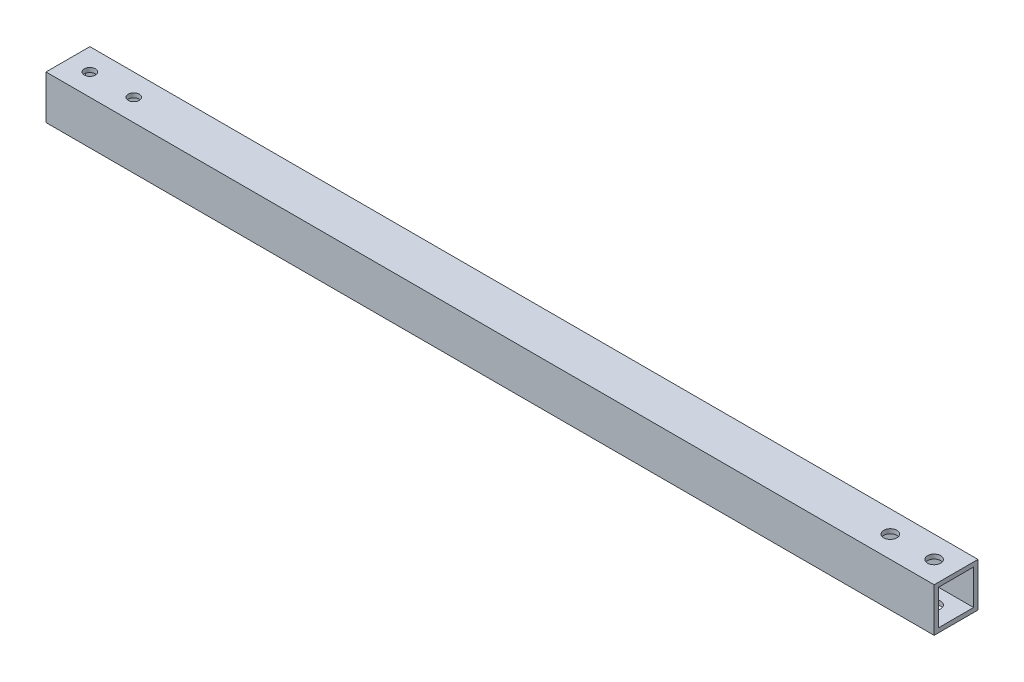
ISO-10303-21;
HEADER;
FILE_DESCRIPTION(('STEP AP214'),'2;1');
FILE_NAME('part.step','',(''),(''),'','','');
FILE_SCHEMA(('AUTOMOTIVE_DESIGN { 1 0 10303 214 1 1 1 1 }'));
ENDSEC;
DATA;
#1=APPLICATION_CONTEXT('core data for automotive mechanical design processes');
#2=APPLICATION_PROTOCOL_DEFINITION('international standard','automotive_design',2000,#1);
#3=PRODUCT_CONTEXT('',#1,'mechanical');
#4=PRODUCT('Part','Part','',(#3));
#5=PRODUCT_RELATED_PRODUCT_CATEGORY('part','',(#4));
#6=PRODUCT_DEFINITION_FORMATION('','',#4);
#7=PRODUCT_DEFINITION_CONTEXT('part definition',#1,'design');
#8=PRODUCT_DEFINITION('design','',#6,#7);
#9=PRODUCT_DEFINITION_SHAPE('','',#8);
#10=(LENGTH_UNIT() NAMED_UNIT(*) SI_UNIT(.MILLI.,.METRE.));
#11=(NAMED_UNIT(*) PLANE_ANGLE_UNIT() SI_UNIT($,.RADIAN.));
#12=(NAMED_UNIT(*) SI_UNIT($,.STERADIAN.) SOLID_ANGLE_UNIT());
#13=UNCERTAINTY_MEASURE_WITH_UNIT(LENGTH_MEASURE(1.E-05),#10,'distance_accuracy_value','');
#14=(GEOMETRIC_REPRESENTATION_CONTEXT(3) GLOBAL_UNCERTAINTY_ASSIGNED_CONTEXT((#13)) GLOBAL_UNIT_ASSIGNED_CONTEXT((#10,
#11,#12)) REPRESENTATION_CONTEXT('',''));
#15=CARTESIAN_POINT('',(0.,0.,0.));
#16=DIRECTION('',(0.,0.,1.));
#17=DIRECTION('',(1.,0.,0.));
#18=AXIS2_PLACEMENT_3D('',#15,#16,#17);
#19=CARTESIAN_POINT('',(202.5,0.,0.));
#20=DIRECTION('',(1.,0.,0.));
#21=DIRECTION('',(0.,0.,-1.));
#22=AXIS2_PLACEMENT_3D('',#19,#20,#21);
#23=PLANE('',#22);
#24=DIRECTION('',(0.,-1.,0.));
#25=VECTOR('',#24,1.);
#26=CARTESIAN_POINT('',(202.5,10.,10.));
#27=LINE('',#26,#25);
#28=CARTESIAN_POINT('',(202.5,10.,10.));
#29=VERTEX_POINT('',#28);
#30=CARTESIAN_POINT('',(202.5,-10.,10.));
#31=VERTEX_POINT('',#30);
#32=EDGE_CURVE('E138',#29,#31,#27,.T.);
#33=ORIENTED_EDGE('',*,*,#32,.T.);
#34=DIRECTION('',(0.,0.,-1.));
#35=VECTOR('',#34,1.);
#36=CARTESIAN_POINT('',(202.5,-10.,10.));
#37=LINE('',#36,#35);
#38=CARTESIAN_POINT('',(202.5,-10.,-10.));
#39=VERTEX_POINT('',#38);
#40=EDGE_CURVE('E141',#31,#39,#37,.T.);
#41=ORIENTED_EDGE('',*,*,#40,.T.);
#42=DIRECTION('',(0.,1.,0.));
#43=VECTOR('',#42,1.);
#44=CARTESIAN_POINT('',(202.5,10.,-10.));
#45=LINE('',#44,#43);
#46=CARTESIAN_POINT('',(202.5,10.,-10.));
#47=VERTEX_POINT('',#46);
#48=EDGE_CURVE('E144',#39,#47,#45,.T.);
#49=ORIENTED_EDGE('',*,*,#48,.T.);
#50=DIRECTION('',(0.,0.,1.));
#51=VECTOR('',#50,1.);
#52=CARTESIAN_POINT('',(202.5,10.,10.));
#53=LINE('',#52,#51);
#54=EDGE_CURVE('E146',#47,#29,#53,.T.);
#55=ORIENTED_EDGE('',*,*,#54,.T.);
#56=EDGE_LOOP('',(#33,#41,#49,#55));
#57=FACE_BOUND('',#56,.T.);
#58=DIRECTION('',(0.,1.,0.));
#59=VECTOR('',#58,1.);
#60=CARTESIAN_POINT('',(202.5,8.,-8.));
#61=LINE('',#60,#59);
#62=CARTESIAN_POINT('',(202.5,-8.,-8.));
#63=VERTEX_POINT('',#62);
#64=CARTESIAN_POINT('',(202.5,8.,-8.));
#65=VERTEX_POINT('',#64);
#66=EDGE_CURVE('E108',#63,#65,#61,.T.);
#67=ORIENTED_EDGE('',*,*,#66,.F.);
#68=DIRECTION('',(0.,0.,-1.));
#69=VECTOR('',#68,1.);
#70=CARTESIAN_POINT('',(202.5,-8.,-8.));
#71=LINE('',#70,#69);
#72=CARTESIAN_POINT('',(202.5,-8.,8.));
#73=VERTEX_POINT('',#72);
#74=EDGE_CURVE('E100',#73,#63,#71,.T.);
#75=ORIENTED_EDGE('',*,*,#74,.F.);
#76=DIRECTION('',(0.,-1.,0.));
#77=VECTOR('',#76,1.);
#78=CARTESIAN_POINT('',(202.5,8.,8.));
#79=LINE('',#78,#77);
#80=CARTESIAN_POINT('',(202.5,8.,8.));
#81=VERTEX_POINT('',#80);
#82=EDGE_CURVE('E122',#81,#73,#79,.T.);
#83=ORIENTED_EDGE('',*,*,#82,.F.);
#84=DIRECTION('',(0.,0.,1.));
#85=VECTOR('',#84,1.);
#86=CARTESIAN_POINT('',(202.5,8.,-8.));
#87=LINE('',#86,#85);
#88=EDGE_CURVE('E120',#65,#81,#87,.T.);
#89=ORIENTED_EDGE('',*,*,#88,.F.);
#90=EDGE_LOOP('',(#67,#75,#83,#89));
#91=FACE_BOUND('',#90,.T.);
#92=ADVANCED_FACE('F33',(#57,#91),#23,.T.);
#93=CARTESIAN_POINT('',(-202.5,0.,0.));
#94=DIRECTION('',(1.,0.,0.));
#95=DIRECTION('',(0.,0.,-1.));
#96=AXIS2_PLACEMENT_3D('',#93,#94,#95);
#97=PLANE('',#96);
#98=DIRECTION('',(0.,-1.,0.));
#99=VECTOR('',#98,1.);
#100=CARTESIAN_POINT('',(-202.5,10.,10.));
#101=LINE('',#100,#99);
#102=CARTESIAN_POINT('',(-202.5,10.,10.));
#103=VERTEX_POINT('',#102);
#104=CARTESIAN_POINT('',(-202.5,-10.,10.));
#105=VERTEX_POINT('',#104);
#106=EDGE_CURVE('E116',#103,#105,#101,.T.);
#107=ORIENTED_EDGE('',*,*,#106,.F.);
#108=DIRECTION('',(0.,0.,1.));
#109=VECTOR('',#108,1.);
#110=CARTESIAN_POINT('',(-202.5,10.,10.));
#111=LINE('',#110,#109);
#112=CARTESIAN_POINT('',(-202.5,10.,-10.));
#113=VERTEX_POINT('',#112);
#114=EDGE_CURVE('E142',#113,#103,#111,.T.);
#115=ORIENTED_EDGE('',*,*,#114,.F.);
#116=DIRECTION('',(0.,1.,0.));
#117=VECTOR('',#116,1.);
#118=CARTESIAN_POINT('',(-202.5,10.,-10.));
#119=LINE('',#118,#117);
#120=CARTESIAN_POINT('',(-202.5,-10.,-10.));
#121=VERTEX_POINT('',#120);
#122=EDGE_CURVE('E153',#121,#113,#119,.T.);
#123=ORIENTED_EDGE('',*,*,#122,.F.);
#124=DIRECTION('',(0.,0.,-1.));
#125=VECTOR('',#124,1.);
#126=CARTESIAN_POINT('',(-202.5,-10.,10.));
#127=LINE('',#126,#125);
#128=EDGE_CURVE('E151',#105,#121,#127,.T.);
#129=ORIENTED_EDGE('',*,*,#128,.F.);
#130=EDGE_LOOP('',(#107,#115,#123,#129));
#131=FACE_BOUND('',#130,.T.);
#132=DIRECTION('',(0.,0.,-1.));
#133=VECTOR('',#132,1.);
#134=CARTESIAN_POINT('',(-202.5,-8.,-8.));
#135=LINE('',#134,#133);
#136=CARTESIAN_POINT('',(-202.5,-8.,8.));
#137=VERTEX_POINT('',#136);
#138=CARTESIAN_POINT('',(-202.5,-8.,-8.));
#139=VERTEX_POINT('',#138);
#140=EDGE_CURVE('E58',#137,#139,#135,.T.);
#141=ORIENTED_EDGE('',*,*,#140,.T.);
#142=DIRECTION('',(0.,1.,0.));
#143=VECTOR('',#142,1.);
#144=CARTESIAN_POINT('',(-202.5,8.,-8.));
#145=LINE('',#144,#143);
#146=CARTESIAN_POINT('',(-202.5,8.,-8.));
#147=VERTEX_POINT('',#146);
#148=EDGE_CURVE('E115',#139,#147,#145,.T.);
#149=ORIENTED_EDGE('',*,*,#148,.T.);
#150=DIRECTION('',(0.,0.,1.));
#151=VECTOR('',#150,1.);
#152=CARTESIAN_POINT('',(-202.5,8.,-8.));
#153=LINE('',#152,#151);
#154=CARTESIAN_POINT('',(-202.5,8.,8.));
#155=VERTEX_POINT('',#154);
#156=EDGE_CURVE('E130',#147,#155,#153,.T.);
#157=ORIENTED_EDGE('',*,*,#156,.T.);
#158=DIRECTION('',(0.,-1.,0.));
#159=VECTOR('',#158,1.);
#160=CARTESIAN_POINT('',(-202.5,8.,8.));
#161=LINE('',#160,#159);
#162=EDGE_CURVE('E109',#155,#137,#161,.T.);
#163=ORIENTED_EDGE('',*,*,#162,.T.);
#164=EDGE_LOOP('',(#141,#149,#157,#163));
#165=FACE_BOUND('',#164,.T.);
#166=ADVANCED_FACE('F224',(#131,#165),#97,.F.);
#167=CARTESIAN_POINT('',(202.5,10.,10.));
#168=DIRECTION('',(0.,0.,-1.));
#169=DIRECTION('',(-1.,0.,0.));
#170=AXIS2_PLACEMENT_3D('',#167,#168,#169);
#171=PLANE('',#170);
#172=ORIENTED_EDGE('',*,*,#106,.T.);
#173=DIRECTION('',(-1.,0.,0.));
#174=VECTOR('',#173,1.);
#175=CARTESIAN_POINT('',(202.5,-10.,10.));
#176=LINE('',#175,#174);
#177=EDGE_CURVE('E11',#31,#105,#176,.T.);
#178=ORIENTED_EDGE('',*,*,#177,.F.);
#179=ORIENTED_EDGE('',*,*,#32,.F.);
#180=DIRECTION('',(-1.,0.,0.));
#181=VECTOR('',#180,1.);
#182=CARTESIAN_POINT('',(202.5,10.,10.));
#183=LINE('',#182,#181);
#184=EDGE_CURVE('E148',#29,#103,#183,.T.);
#185=ORIENTED_EDGE('',*,*,#184,.T.);
#186=EDGE_LOOP('',(#172,#178,#179,#185));
#187=FACE_BOUND('',#186,.T.);
#188=ADVANCED_FACE('F35',(#187),#171,.F.);
#189=CARTESIAN_POINT('',(202.5,-10.,10.));
#190=DIRECTION('',(0.,1.,0.));
#191=DIRECTION('',(0.,0.,1.));
#192=AXIS2_PLACEMENT_3D('',#189,#190,#191);
#193=PLANE('',#192);
#194=CARTESIAN_POINT('',(-172.5,-10.,0.));
#195=DIRECTION('',(0.,1.,0.));
#196=DIRECTION('',(0.,0.,1.));
#197=AXIS2_PLACEMENT_3D('',#194,#195,#196);
#198=CIRCLE('',#197,2.5);
#199=CARTESIAN_POINT('',(-172.5,-10.,2.50000000000002));
#200=VERTEX_POINT('',#199);
#201=EDGE_CURVE('E243',#200,#200,#198,.T.);
#202=ORIENTED_EDGE('',*,*,#201,.T.);
#203=EDGE_LOOP('',(#202));
#204=FACE_BOUND('',#203,.T.);
#205=CARTESIAN_POINT('',(-192.5,-10.,0.));
#206=DIRECTION('',(0.,1.,0.));
#207=DIRECTION('',(0.,0.,1.));
#208=AXIS2_PLACEMENT_3D('',#205,#206,#207);
#209=CIRCLE('',#208,2.5);
#210=CARTESIAN_POINT('',(-192.5,-10.,2.50000000000002));
#211=VERTEX_POINT('',#210);
#212=EDGE_CURVE('E174',#211,#211,#209,.T.);
#213=ORIENTED_EDGE('',*,*,#212,.T.);
#214=EDGE_LOOP('',(#213));
#215=FACE_BOUND('',#214,.T.);
#216=CARTESIAN_POINT('',(172.5,-10.,0.));
#217=DIRECTION('',(0.,1.,0.));
#218=DIRECTION('',(0.,0.,1.));
#219=AXIS2_PLACEMENT_3D('',#216,#217,#218);
#220=CIRCLE('',#219,2.99999999999999);
#221=CARTESIAN_POINT('',(172.5,-10.,2.99999999999999));
#222=VERTEX_POINT('',#221);
#223=EDGE_CURVE('E170',#222,#222,#220,.T.);
#224=ORIENTED_EDGE('',*,*,#223,.T.);
#225=EDGE_LOOP('',(#224));
#226=FACE_BOUND('',#225,.T.);
#227=CARTESIAN_POINT('',(192.5,-10.,0.));
#228=DIRECTION('',(0.,1.,0.));
#229=DIRECTION('',(0.,0.,1.));
#230=AXIS2_PLACEMENT_3D('',#227,#228,#229);
#231=CIRCLE('',#230,2.99999999999999);
#232=CARTESIAN_POINT('',(192.5,-10.,2.99999999999999));
#233=VERTEX_POINT('',#232);
#234=EDGE_CURVE('E166',#233,#233,#231,.T.);
#235=ORIENTED_EDGE('',*,*,#234,.T.);
#236=EDGE_LOOP('',(#235));
#237=FACE_BOUND('',#236,.T.);
#238=ORIENTED_EDGE('',*,*,#128,.T.);
#239=DIRECTION('',(-1.,0.,0.));
#240=VECTOR('',#239,1.);
#241=CARTESIAN_POINT('',(202.5,-10.,-10.));
#242=LINE('',#241,#240);
#243=EDGE_CURVE('E42',#39,#121,#242,.T.);
#244=ORIENTED_EDGE('',*,*,#243,.F.);
#245=ORIENTED_EDGE('',*,*,#40,.F.);
#246=ORIENTED_EDGE('',*,*,#177,.T.);
#247=EDGE_LOOP('',(#238,#244,#245,#246));
#248=FACE_BOUND('',#247,.T.);
#249=ADVANCED_FACE('F233',(#204,#215,#226,#237,#248),#193,.F.);
#250=CARTESIAN_POINT('',(202.5,10.,-10.));
#251=DIRECTION('',(0.,0.,1.));
#252=DIRECTION('',(1.,0.,0.));
#253=AXIS2_PLACEMENT_3D('',#250,#251,#252);
#254=PLANE('',#253);
#255=ORIENTED_EDGE('',*,*,#122,.T.);
#256=DIRECTION('',(-1.,0.,0.));
#257=VECTOR('',#256,1.);
#258=CARTESIAN_POINT('',(202.5,10.,-10.));
#259=LINE('',#258,#257);
#260=EDGE_CURVE('E158',#47,#113,#259,.T.);
#261=ORIENTED_EDGE('',*,*,#260,.F.);
#262=ORIENTED_EDGE('',*,*,#48,.F.);
#263=ORIENTED_EDGE('',*,*,#243,.T.);
#264=EDGE_LOOP('',(#255,#261,#262,#263));
#265=FACE_BOUND('',#264,.T.);
#266=ADVANCED_FACE('F217',(#265),#254,.F.);
#267=CARTESIAN_POINT('',(202.5,10.,10.));
#268=DIRECTION('',(0.,-1.,0.));
#269=DIRECTION('',(0.,0.,-1.));
#270=AXIS2_PLACEMENT_3D('',#267,#268,#269);
#271=PLANE('',#270);
#272=CARTESIAN_POINT('',(-172.5,10.,0.));
#273=DIRECTION('',(0.,1.,0.));
#274=DIRECTION('',(0.,0.,1.));
#275=AXIS2_PLACEMENT_3D('',#272,#273,#274);
#276=CIRCLE('',#275,2.5);
#277=CARTESIAN_POINT('',(-172.5,10.,2.50000000000002));
#278=VERTEX_POINT('',#277);
#279=EDGE_CURVE('E299',#278,#278,#276,.T.);
#280=ORIENTED_EDGE('',*,*,#279,.F.);
#281=EDGE_LOOP('',(#280));
#282=FACE_BOUND('',#281,.T.);
#283=CARTESIAN_POINT('',(-192.5,10.,0.));
#284=DIRECTION('',(0.,1.,0.));
#285=DIRECTION('',(0.,0.,1.));
#286=AXIS2_PLACEMENT_3D('',#283,#284,#285);
#287=CIRCLE('',#286,2.5);
#288=CARTESIAN_POINT('',(-192.5,10.,2.50000000000002));
#289=VERTEX_POINT('',#288);
#290=EDGE_CURVE('E181',#289,#289,#287,.T.);
#291=ORIENTED_EDGE('',*,*,#290,.F.);
#292=EDGE_LOOP('',(#291));
#293=FACE_BOUND('',#292,.T.);
#294=CARTESIAN_POINT('',(172.5,10.,0.));
#295=DIRECTION('',(0.,1.,0.));
#296=DIRECTION('',(0.,0.,1.));
#297=AXIS2_PLACEMENT_3D('',#294,#295,#296);
#298=CIRCLE('',#297,2.99999999999999);
#299=CARTESIAN_POINT('',(172.5,10.,2.99999999999999));
#300=VERTEX_POINT('',#299);
#301=EDGE_CURVE('E178',#300,#300,#298,.T.);
#302=ORIENTED_EDGE('',*,*,#301,.F.);
#303=EDGE_LOOP('',(#302));
#304=FACE_BOUND('',#303,.T.);
#305=CARTESIAN_POINT('',(192.5,10.,0.));
#306=DIRECTION('',(0.,1.,0.));
#307=DIRECTION('',(0.,0.,1.));
#308=AXIS2_PLACEMENT_3D('',#305,#306,#307);
#309=CIRCLE('',#308,2.99999999999999);
#310=CARTESIAN_POINT('',(192.5,10.,2.99999999999999));
#311=VERTEX_POINT('',#310);
#312=EDGE_CURVE('E197',#311,#311,#309,.T.);
#313=ORIENTED_EDGE('',*,*,#312,.F.);
#314=EDGE_LOOP('',(#313));
#315=FACE_BOUND('',#314,.T.);
#316=ORIENTED_EDGE('',*,*,#114,.T.);
#317=ORIENTED_EDGE('',*,*,#184,.F.);
#318=ORIENTED_EDGE('',*,*,#54,.F.);
#319=ORIENTED_EDGE('',*,*,#260,.T.);
#320=EDGE_LOOP('',(#316,#317,#318,#319));
#321=FACE_BOUND('',#320,.T.);
#322=ADVANCED_FACE('F208',(#282,#293,#304,#315,#321),#271,.F.);
#323=CARTESIAN_POINT('',(202.5,-8.,-8.));
#324=DIRECTION('',(0.,1.,0.));
#325=DIRECTION('',(0.,0.,1.));
#326=AXIS2_PLACEMENT_3D('',#323,#324,#325);
#327=PLANE('',#326);
#328=CARTESIAN_POINT('',(-172.5,-8.,0.));
#329=DIRECTION('',(0.,1.,0.));
#330=DIRECTION('',(0.,0.,1.));
#331=AXIS2_PLACEMENT_3D('',#328,#329,#330);
#332=CIRCLE('',#331,2.5);
#333=CARTESIAN_POINT('',(-172.5,-8.,2.50000000000002));
#334=VERTEX_POINT('',#333);
#335=EDGE_CURVE('E186',#334,#334,#332,.T.);
#336=ORIENTED_EDGE('',*,*,#335,.F.);
#337=EDGE_LOOP('',(#336));
#338=FACE_BOUND('',#337,.T.);
#339=CARTESIAN_POINT('',(-192.5,-8.,0.));
#340=DIRECTION('',(0.,1.,0.));
#341=DIRECTION('',(0.,0.,1.));
#342=AXIS2_PLACEMENT_3D('',#339,#340,#341);
#343=CIRCLE('',#342,2.5);
#344=CARTESIAN_POINT('',(-192.5,-8.,2.50000000000002));
#345=VERTEX_POINT('',#344);
#346=EDGE_CURVE('E173',#345,#345,#343,.T.);
#347=ORIENTED_EDGE('',*,*,#346,.F.);
#348=EDGE_LOOP('',(#347));
#349=FACE_BOUND('',#348,.T.);
#350=CARTESIAN_POINT('',(172.5,-8.,0.));
#351=DIRECTION('',(0.,1.,0.));
#352=DIRECTION('',(0.,0.,1.));
#353=AXIS2_PLACEMENT_3D('',#350,#351,#352);
#354=CIRCLE('',#353,2.99999999999999);
#355=CARTESIAN_POINT('',(172.5,-8.,2.99999999999999));
#356=VERTEX_POINT('',#355);
#357=EDGE_CURVE('E169',#356,#356,#354,.T.);
#358=ORIENTED_EDGE('',*,*,#357,.F.);
#359=EDGE_LOOP('',(#358));
#360=FACE_BOUND('',#359,.T.);
#361=CARTESIAN_POINT('',(192.5,-8.,0.));
#362=DIRECTION('',(0.,1.,0.));
#363=DIRECTION('',(0.,0.,1.));
#364=AXIS2_PLACEMENT_3D('',#361,#362,#363);
#365=CIRCLE('',#364,2.99999999999999);
#366=CARTESIAN_POINT('',(192.5,-8.,2.99999999999999));
#367=VERTEX_POINT('',#366);
#368=EDGE_CURVE('E128',#367,#367,#365,.T.);
#369=ORIENTED_EDGE('',*,*,#368,.F.);
#370=EDGE_LOOP('',(#369));
#371=FACE_BOUND('',#370,.T.);
#372=ORIENTED_EDGE('',*,*,#140,.F.);
#373=DIRECTION('',(-1.,0.,0.));
#374=VECTOR('',#373,1.);
#375=CARTESIAN_POINT('',(202.5,-8.,8.));
#376=LINE('',#375,#374);
#377=EDGE_CURVE('E104',#73,#137,#376,.T.);
#378=ORIENTED_EDGE('',*,*,#377,.F.);
#379=ORIENTED_EDGE('',*,*,#74,.T.);
#380=DIRECTION('',(-1.,0.,0.));
#381=VECTOR('',#380,1.);
#382=CARTESIAN_POINT('',(202.5,-8.,-8.));
#383=LINE('',#382,#381);
#384=EDGE_CURVE('E103',#63,#139,#383,.T.);
#385=ORIENTED_EDGE('',*,*,#384,.T.);
#386=EDGE_LOOP('',(#372,#378,#379,#385));
#387=FACE_BOUND('',#386,.T.);
#388=ADVANCED_FACE('F102',(#338,#349,#360,#371,#387),#327,.T.);
#389=CARTESIAN_POINT('',(202.5,8.,-8.));
#390=DIRECTION('',(0.,0.,1.));
#391=DIRECTION('',(1.,0.,0.));
#392=AXIS2_PLACEMENT_3D('',#389,#390,#391);
#393=PLANE('',#392);
#394=ORIENTED_EDGE('',*,*,#148,.F.);
#395=ORIENTED_EDGE('',*,*,#384,.F.);
#396=ORIENTED_EDGE('',*,*,#66,.T.);
#397=DIRECTION('',(-1.,0.,0.));
#398=VECTOR('',#397,1.);
#399=CARTESIAN_POINT('',(202.5,8.,-8.));
#400=LINE('',#399,#398);
#401=EDGE_CURVE('E117',#65,#147,#400,.T.);
#402=ORIENTED_EDGE('',*,*,#401,.T.);
#403=EDGE_LOOP('',(#394,#395,#396,#402));
#404=FACE_BOUND('',#403,.T.);
#405=ADVANCED_FACE('F112',(#404),#393,.T.);
#406=CARTESIAN_POINT('',(202.5,8.,-8.));
#407=DIRECTION('',(0.,-1.,0.));
#408=DIRECTION('',(0.,0.,-1.));
#409=AXIS2_PLACEMENT_3D('',#406,#407,#408);
#410=PLANE('',#409);
#411=CARTESIAN_POINT('',(-172.5,8.,0.));
#412=DIRECTION('',(0.,-1.,0.));
#413=DIRECTION('',(0.,0.,-1.));
#414=AXIS2_PLACEMENT_3D('',#411,#412,#413);
#415=CIRCLE('',#414,2.5);
#416=CARTESIAN_POINT('',(-172.5,8.,-2.49999999999997));
#417=VERTEX_POINT('',#416);
#418=EDGE_CURVE('E37',#417,#417,#415,.T.);
#419=ORIENTED_EDGE('',*,*,#418,.F.);
#420=EDGE_LOOP('',(#419));
#421=FACE_BOUND('',#420,.T.);
#422=CARTESIAN_POINT('',(-192.5,8.,0.));
#423=DIRECTION('',(0.,-1.,0.));
#424=DIRECTION('',(0.,0.,-1.));
#425=AXIS2_PLACEMENT_3D('',#422,#423,#424);
#426=CIRCLE('',#425,2.5);
#427=CARTESIAN_POINT('',(-192.5,8.,-2.49999999999997));
#428=VERTEX_POINT('',#427);
#429=EDGE_CURVE('E171',#428,#428,#426,.T.);
#430=ORIENTED_EDGE('',*,*,#429,.F.);
#431=EDGE_LOOP('',(#430));
#432=FACE_BOUND('',#431,.T.);
#433=CARTESIAN_POINT('',(172.5,8.,0.));
#434=DIRECTION('',(0.,-1.,0.));
#435=DIRECTION('',(0.,0.,-1.));
#436=AXIS2_PLACEMENT_3D('',#433,#434,#435);
#437=CIRCLE('',#436,2.99999999999999);
#438=CARTESIAN_POINT('',(172.5,8.,-2.99999999999999));
#439=VERTEX_POINT('',#438);
#440=EDGE_CURVE('E167',#439,#439,#437,.T.);
#441=ORIENTED_EDGE('',*,*,#440,.F.);
#442=EDGE_LOOP('',(#441));
#443=FACE_BOUND('',#442,.T.);
#444=CARTESIAN_POINT('',(192.5,8.,0.));
#445=DIRECTION('',(0.,-1.,0.));
#446=DIRECTION('',(0.,0.,-1.));
#447=AXIS2_PLACEMENT_3D('',#444,#445,#446);
#448=CIRCLE('',#447,2.99999999999999);
#449=CARTESIAN_POINT('',(192.5,8.,-2.99999999999999));
#450=VERTEX_POINT('',#449);
#451=EDGE_CURVE('E163',#450,#450,#448,.T.);
#452=ORIENTED_EDGE('',*,*,#451,.F.);
#453=EDGE_LOOP('',(#452));
#454=FACE_BOUND('',#453,.T.);
#455=ORIENTED_EDGE('',*,*,#156,.F.);
#456=ORIENTED_EDGE('',*,*,#401,.F.);
#457=ORIENTED_EDGE('',*,*,#88,.T.);
#458=DIRECTION('',(-1.,0.,0.));
#459=VECTOR('',#458,1.);
#460=CARTESIAN_POINT('',(202.5,8.,8.));
#461=LINE('',#460,#459);
#462=EDGE_CURVE('E50',#81,#155,#461,.T.);
#463=ORIENTED_EDGE('',*,*,#462,.T.);
#464=EDGE_LOOP('',(#455,#456,#457,#463));
#465=FACE_BOUND('',#464,.T.);
#466=ADVANCED_FACE('F215',(#421,#432,#443,#454,#465),#410,.T.);
#467=CARTESIAN_POINT('',(202.5,8.,8.));
#468=DIRECTION('',(0.,0.,-1.));
#469=DIRECTION('',(-1.,0.,0.));
#470=AXIS2_PLACEMENT_3D('',#467,#468,#469);
#471=PLANE('',#470);
#472=ORIENTED_EDGE('',*,*,#162,.F.);
#473=ORIENTED_EDGE('',*,*,#462,.F.);
#474=ORIENTED_EDGE('',*,*,#82,.T.);
#475=ORIENTED_EDGE('',*,*,#377,.T.);
#476=EDGE_LOOP('',(#472,#473,#474,#475));
#477=FACE_BOUND('',#476,.T.);
#478=ADVANCED_FACE('F262',(#477),#471,.T.);
#479=CARTESIAN_POINT('',(192.5,-10.,0.));
#480=DIRECTION('',(0.,1.,0.));
#481=DIRECTION('',(0.,0.,1.));
#482=AXIS2_PLACEMENT_3D('',#479,#480,#481);
#483=CYLINDRICAL_SURFACE('',#482,2.99999999999999);
#484=ORIENTED_EDGE('',*,*,#451,.T.);
#485=EDGE_LOOP('',(#484));
#486=FACE_BOUND('',#485,.T.);
#487=ORIENTED_EDGE('',*,*,#312,.T.);
#488=EDGE_LOOP('',(#487));
#489=FACE_BOUND('',#488,.T.);
#490=ADVANCED_FACE('F264',(#486,#489),#483,.F.);
#491=ORIENTED_EDGE('',*,*,#368,.T.);
#492=EDGE_LOOP('',(#491));
#493=FACE_BOUND('',#492,.T.);
#494=ORIENTED_EDGE('',*,*,#234,.F.);
#495=EDGE_LOOP('',(#494));
#496=FACE_BOUND('',#495,.T.);
#497=ADVANCED_FACE('F204',(#493,#496),#483,.F.);
#498=CARTESIAN_POINT('',(172.5,-10.,0.));
#499=DIRECTION('',(0.,1.,0.));
#500=DIRECTION('',(0.,0.,1.));
#501=AXIS2_PLACEMENT_3D('',#498,#499,#500);
#502=CYLINDRICAL_SURFACE('',#501,2.99999999999999);
#503=ORIENTED_EDGE('',*,*,#440,.T.);
#504=EDGE_LOOP('',(#503));
#505=FACE_BOUND('',#504,.T.);
#506=ORIENTED_EDGE('',*,*,#301,.T.);
#507=EDGE_LOOP('',(#506));
#508=FACE_BOUND('',#507,.T.);
#509=ADVANCED_FACE('F275',(#505,#508),#502,.F.);
#510=ORIENTED_EDGE('',*,*,#357,.T.);
#511=EDGE_LOOP('',(#510));
#512=FACE_BOUND('',#511,.T.);
#513=ORIENTED_EDGE('',*,*,#223,.F.);
#514=EDGE_LOOP('',(#513));
#515=FACE_BOUND('',#514,.T.);
#516=ADVANCED_FACE('F278',(#512,#515),#502,.F.);
#517=CARTESIAN_POINT('',(-192.5,-10.,0.));
#518=DIRECTION('',(0.,1.,0.));
#519=DIRECTION('',(0.,0.,1.));
#520=AXIS2_PLACEMENT_3D('',#517,#518,#519);
#521=CYLINDRICAL_SURFACE('',#520,2.5);
#522=ORIENTED_EDGE('',*,*,#429,.T.);
#523=EDGE_LOOP('',(#522));
#524=FACE_BOUND('',#523,.T.);
#525=ORIENTED_EDGE('',*,*,#290,.T.);
#526=EDGE_LOOP('',(#525));
#527=FACE_BOUND('',#526,.T.);
#528=ADVANCED_FACE('F280',(#524,#527),#521,.F.);
#529=ORIENTED_EDGE('',*,*,#346,.T.);
#530=EDGE_LOOP('',(#529));
#531=FACE_BOUND('',#530,.T.);
#532=ORIENTED_EDGE('',*,*,#212,.F.);
#533=EDGE_LOOP('',(#532));
#534=FACE_BOUND('',#533,.T.);
#535=ADVANCED_FACE('F283',(#531,#534),#521,.F.);
#536=CARTESIAN_POINT('',(-172.5,-10.,0.));
#537=DIRECTION('',(0.,1.,0.));
#538=DIRECTION('',(0.,0.,1.));
#539=AXIS2_PLACEMENT_3D('',#536,#537,#538);
#540=CYLINDRICAL_SURFACE('',#539,2.5);
#541=ORIENTED_EDGE('',*,*,#418,.T.);
#542=EDGE_LOOP('',(#541));
#543=FACE_BOUND('',#542,.T.);
#544=ORIENTED_EDGE('',*,*,#279,.T.);
#545=EDGE_LOOP('',(#544));
#546=FACE_BOUND('',#545,.T.);
#547=ADVANCED_FACE('F284',(#543,#546),#540,.F.);
#548=ORIENTED_EDGE('',*,*,#335,.T.);
#549=EDGE_LOOP('',(#548));
#550=FACE_BOUND('',#549,.T.);
#551=ORIENTED_EDGE('',*,*,#201,.F.);
#552=EDGE_LOOP('',(#551));
#553=FACE_BOUND('',#552,.T.);
#554=ADVANCED_FACE('F286',(#550,#553),#540,.F.);
#555=CLOSED_SHELL('',(#92,#166,#188,#249,#266,#322,#388,#405,#466,#478,#490,#497,#509,#516,#528,
#535,#547,#554));
#556=MANIFOLD_SOLID_BREP('B2',#555);
#557=ADVANCED_BREP_SHAPE_REPRESENTATION('',(#18,#556),#14);
#558=SHAPE_DEFINITION_REPRESENTATION(#9,#557);
ENDSEC;
END-ISO-10303-21;
